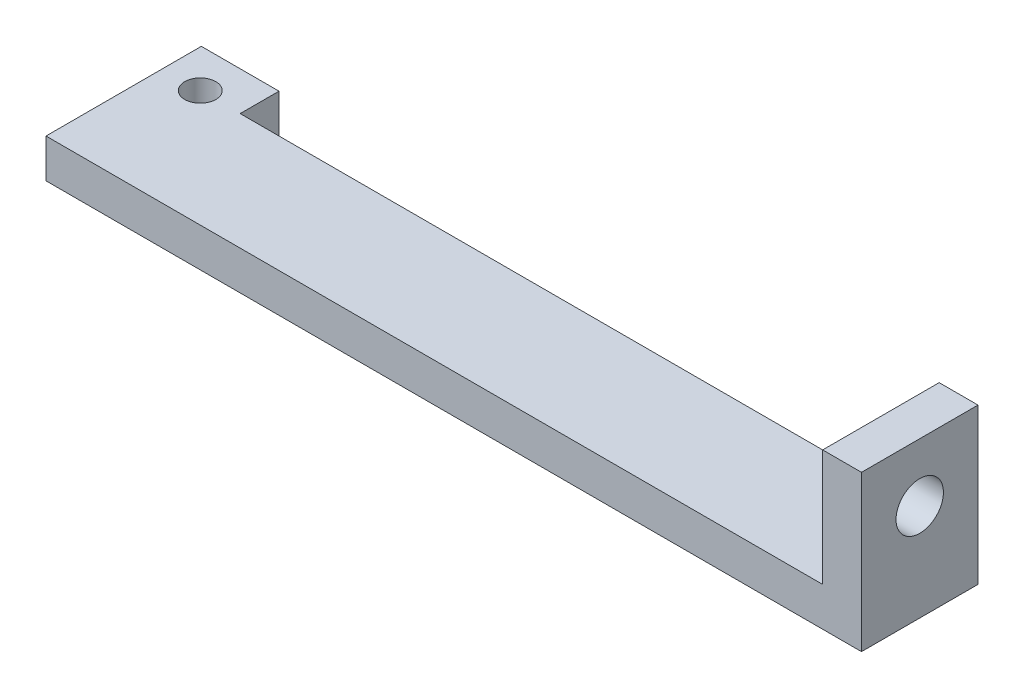
ISO-10303-21;
HEADER;
FILE_DESCRIPTION(('STEP AP214'),'2;1');
FILE_NAME('part.step','',(''),(''),'','','');
FILE_SCHEMA(('AUTOMOTIVE_DESIGN { 1 0 10303 214 1 1 1 1 }'));
ENDSEC;
DATA;
#1=APPLICATION_CONTEXT('core data for automotive mechanical design processes');
#2=APPLICATION_PROTOCOL_DEFINITION('international standard','automotive_design',2000,#1);
#3=PRODUCT_CONTEXT('',#1,'mechanical');
#4=PRODUCT('Part','Part','',(#3));
#5=PRODUCT_RELATED_PRODUCT_CATEGORY('part','',(#4));
#6=PRODUCT_DEFINITION_FORMATION('','',#4);
#7=PRODUCT_DEFINITION_CONTEXT('part definition',#1,'design');
#8=PRODUCT_DEFINITION('design','',#6,#7);
#9=PRODUCT_DEFINITION_SHAPE('','',#8);
#10=(LENGTH_UNIT() NAMED_UNIT(*) SI_UNIT(.MILLI.,.METRE.));
#11=(NAMED_UNIT(*) PLANE_ANGLE_UNIT() SI_UNIT($,.RADIAN.));
#12=(NAMED_UNIT(*) SI_UNIT($,.STERADIAN.) SOLID_ANGLE_UNIT());
#13=UNCERTAINTY_MEASURE_WITH_UNIT(LENGTH_MEASURE(1.E-05),#10,'distance_accuracy_value','');
#14=(GEOMETRIC_REPRESENTATION_CONTEXT(3) GLOBAL_UNCERTAINTY_ASSIGNED_CONTEXT((#13)) GLOBAL_UNIT_ASSIGNED_CONTEXT((#10,
#11,#12)) REPRESENTATION_CONTEXT('',''));
#15=CARTESIAN_POINT('',(0.,0.,0.));
#16=DIRECTION('',(0.,0.,1.));
#17=DIRECTION('',(1.,0.,0.));
#18=AXIS2_PLACEMENT_3D('',#15,#16,#17);
#19=CARTESIAN_POINT('',(0.,2.54,0.));
#20=DIRECTION('',(0.,-1.,0.));
#21=DIRECTION('',(0.,0.,-1.));
#22=AXIS2_PLACEMENT_3D('',#19,#20,#21);
#23=PLANE('',#22);
#24=CARTESIAN_POINT('',(-2.60853382470327,2.54,-7.62));
#25=DIRECTION('',(0.,1.,0.));
#26=DIRECTION('',(0.,0.,1.));
#27=AXIS2_PLACEMENT_3D('',#24,#25,#26);
#28=CIRCLE('',#27,1.016);
#29=CARTESIAN_POINT('',(-2.60853382470327,2.54,-6.604));
#30=VERTEX_POINT('',#29);
#31=EDGE_CURVE('E138',#30,#30,#28,.T.);
#32=ORIENTED_EDGE('',*,*,#31,.F.);
#33=EDGE_LOOP('',(#32));
#34=FACE_BOUND('',#33,.T.);
#35=DIRECTION('',(0.,0.,1.));
#36=VECTOR('',#35,1.);
#37=CARTESIAN_POINT('',(45.72,2.54,0.));
#38=LINE('',#37,#36);
#39=CARTESIAN_POINT('',(45.72,2.54,-7.62));
#40=VERTEX_POINT('',#39);
#41=CARTESIAN_POINT('',(45.72,2.54,0.));
#42=VERTEX_POINT('',#41);
#43=EDGE_CURVE('E54',#40,#42,#38,.T.);
#44=ORIENTED_EDGE('',*,*,#43,.F.);
#45=DIRECTION('',(-1.,0.,0.));
#46=VECTOR('',#45,1.);
#47=CARTESIAN_POINT('',(0.,2.54,-7.62));
#48=LINE('',#47,#46);
#49=CARTESIAN_POINT('',(0.,2.54,-7.62));
#50=VERTEX_POINT('',#49);
#51=EDGE_CURVE('E59',#40,#50,#48,.T.);
#52=ORIENTED_EDGE('',*,*,#51,.T.);
#53=DIRECTION('',(0.,0.,-1.));
#54=VECTOR('',#53,1.);
#55=CARTESIAN_POINT('',(0.,2.54,0.));
#56=LINE('',#55,#54);
#57=CARTESIAN_POINT('',(0.,2.54,-10.16));
#58=VERTEX_POINT('',#57);
#59=EDGE_CURVE('E103',#50,#58,#56,.T.);
#60=ORIENTED_EDGE('',*,*,#59,.T.);
#61=DIRECTION('',(-1.,0.,0.));
#62=VECTOR('',#61,1.);
#63=CARTESIAN_POINT('',(0.,2.54,-10.16));
#64=LINE('',#63,#62);
#65=CARTESIAN_POINT('',(-5.08,2.54,-10.16));
#66=VERTEX_POINT('',#65);
#67=EDGE_CURVE('E150',#58,#66,#64,.T.);
#68=ORIENTED_EDGE('',*,*,#67,.T.);
#69=DIRECTION('',(0.,0.,1.));
#70=VECTOR('',#69,1.);
#71=CARTESIAN_POINT('',(-5.08,2.54,0.));
#72=LINE('',#71,#70);
#73=CARTESIAN_POINT('',(-5.08,2.54,0.));
#74=VERTEX_POINT('',#73);
#75=EDGE_CURVE('E153',#66,#74,#72,.T.);
#76=ORIENTED_EDGE('',*,*,#75,.T.);
#77=DIRECTION('',(1.,0.,0.));
#78=VECTOR('',#77,1.);
#79=CARTESIAN_POINT('',(0.,2.54,0.));
#80=LINE('',#79,#78);
#81=EDGE_CURVE('E84',#74,#42,#80,.T.);
#82=ORIENTED_EDGE('',*,*,#81,.T.);
#83=EDGE_LOOP('',(#44,#52,#60,#68,#76,#82));
#84=FACE_BOUND('',#83,.T.);
#85=ADVANCED_FACE('F39',(#34,#84),#23,.F.);
#86=CARTESIAN_POINT('',(0.,2.54,0.));
#87=DIRECTION('',(0.,0.,-1.));
#88=DIRECTION('',(-1.,0.,0.));
#89=AXIS2_PLACEMENT_3D('',#86,#87,#88);
#90=PLANE('',#89);
#91=DIRECTION('',(1.,0.,0.));
#92=VECTOR('',#91,1.);
#93=CARTESIAN_POINT('',(0.,0.,0.));
#94=LINE('',#93,#92);
#95=CARTESIAN_POINT('',(-5.08,0.,0.));
#96=VERTEX_POINT('',#95);
#97=CARTESIAN_POINT('',(48.26,0.,0.));
#98=VERTEX_POINT('',#97);
#99=EDGE_CURVE('E72',#96,#98,#94,.T.);
#100=ORIENTED_EDGE('',*,*,#99,.T.);
#101=DIRECTION('',(0.,-1.,0.));
#102=VECTOR('',#101,1.);
#103=CARTESIAN_POINT('',(48.26,2.54,0.));
#104=LINE('',#103,#102);
#105=CARTESIAN_POINT('',(48.26,10.16,0.));
#106=VERTEX_POINT('',#105);
#107=EDGE_CURVE('E11',#106,#98,#104,.T.);
#108=ORIENTED_EDGE('',*,*,#107,.F.);
#109=DIRECTION('',(1.,0.,0.));
#110=VECTOR('',#109,1.);
#111=CARTESIAN_POINT('',(45.72,10.16,0.));
#112=LINE('',#111,#110);
#113=CARTESIAN_POINT('',(45.72,10.16,0.));
#114=VERTEX_POINT('',#113);
#115=EDGE_CURVE('E125',#114,#106,#112,.T.);
#116=ORIENTED_EDGE('',*,*,#115,.F.);
#117=DIRECTION('',(0.,1.,0.));
#118=VECTOR('',#117,1.);
#119=CARTESIAN_POINT('',(45.72,10.16,0.));
#120=LINE('',#119,#118);
#121=EDGE_CURVE('E132',#42,#114,#120,.T.);
#122=ORIENTED_EDGE('',*,*,#121,.F.);
#123=ORIENTED_EDGE('',*,*,#81,.F.);
#124=DIRECTION('',(0.,-1.,0.));
#125=VECTOR('',#124,1.);
#126=CARTESIAN_POINT('',(-5.08,2.54,0.));
#127=LINE('',#126,#125);
#128=EDGE_CURVE('E155',#74,#96,#127,.T.);
#129=ORIENTED_EDGE('',*,*,#128,.T.);
#130=EDGE_LOOP('',(#100,#108,#116,#122,#123,#129));
#131=FACE_BOUND('',#130,.T.);
#132=ADVANCED_FACE('F41',(#131),#90,.F.);
#133=CARTESIAN_POINT('',(48.26,2.54,0.));
#134=DIRECTION('',(-1.,0.,0.));
#135=DIRECTION('',(0.,0.,1.));
#136=AXIS2_PLACEMENT_3D('',#133,#134,#135);
#137=PLANE('',#136);
#138=CARTESIAN_POINT('',(48.26,6.35,-3.81));
#139=DIRECTION('',(-1.,0.,0.));
#140=DIRECTION('',(0.,0.,1.));
#141=AXIS2_PLACEMENT_3D('',#138,#139,#140);
#142=CIRCLE('',#141,1.55);
#143=CARTESIAN_POINT('',(48.26,6.35,-2.26));
#144=VERTEX_POINT('',#143);
#145=EDGE_CURVE('E184',#144,#144,#142,.T.);
#146=ORIENTED_EDGE('',*,*,#145,.T.);
#147=EDGE_LOOP('',(#146));
#148=FACE_BOUND('',#147,.T.);
#149=DIRECTION('',(0.,0.,-1.));
#150=VECTOR('',#149,1.);
#151=CARTESIAN_POINT('',(48.26,0.,0.));
#152=LINE('',#151,#150);
#153=CARTESIAN_POINT('',(48.26,0.,-7.62));
#154=VERTEX_POINT('',#153);
#155=EDGE_CURVE('E171',#98,#154,#152,.T.);
#156=ORIENTED_EDGE('',*,*,#155,.T.);
#157=DIRECTION('',(0.,-1.,0.));
#158=VECTOR('',#157,1.);
#159=CARTESIAN_POINT('',(48.26,2.54,-7.62));
#160=LINE('',#159,#158);
#161=CARTESIAN_POINT('',(48.26,10.16,-7.62));
#162=VERTEX_POINT('',#161);
#163=EDGE_CURVE('E47',#162,#154,#160,.T.);
#164=ORIENTED_EDGE('',*,*,#163,.F.);
#165=DIRECTION('',(0.,0.,-1.));
#166=VECTOR('',#165,1.);
#167=CARTESIAN_POINT('',(48.26,10.16,-7.62));
#168=LINE('',#167,#166);
#169=EDGE_CURVE('E135',#106,#162,#168,.T.);
#170=ORIENTED_EDGE('',*,*,#169,.F.);
#171=ORIENTED_EDGE('',*,*,#107,.T.);
#172=EDGE_LOOP('',(#156,#164,#170,#171));
#173=FACE_BOUND('',#172,.T.);
#174=ADVANCED_FACE('F214',(#148,#173),#137,.F.);
#175=CARTESIAN_POINT('',(0.,2.54,-7.62));
#176=DIRECTION('',(0.,0.,1.));
#177=DIRECTION('',(1.,0.,0.));
#178=AXIS2_PLACEMENT_3D('',#175,#176,#177);
#179=PLANE('',#178);
#180=DIRECTION('',(-1.,0.,0.));
#181=VECTOR('',#180,1.);
#182=CARTESIAN_POINT('',(0.,0.,-7.62));
#183=LINE('',#182,#181);
#184=CARTESIAN_POINT('',(0.,0.,-7.62));
#185=VERTEX_POINT('',#184);
#186=EDGE_CURVE('E78',#154,#185,#183,.T.);
#187=ORIENTED_EDGE('',*,*,#186,.T.);
#188=DIRECTION('',(0.,-1.,0.));
#189=VECTOR('',#188,1.);
#190=CARTESIAN_POINT('',(0.,2.54,-7.62));
#191=LINE('',#190,#189);
#192=EDGE_CURVE('E169',#50,#185,#191,.T.);
#193=ORIENTED_EDGE('',*,*,#192,.F.);
#194=ORIENTED_EDGE('',*,*,#51,.F.);
#195=DIRECTION('',(0.,-1.,0.));
#196=VECTOR('',#195,1.);
#197=CARTESIAN_POINT('',(45.72,2.54,-7.62));
#198=LINE('',#197,#196);
#199=CARTESIAN_POINT('',(45.72,10.16,-7.62));
#200=VERTEX_POINT('',#199);
#201=EDGE_CURVE('E131',#200,#40,#198,.T.);
#202=ORIENTED_EDGE('',*,*,#201,.F.);
#203=DIRECTION('',(1.,0.,0.));
#204=VECTOR('',#203,1.);
#205=CARTESIAN_POINT('',(45.72,10.16,-7.62));
#206=LINE('',#205,#204);
#207=EDGE_CURVE('E127',#200,#162,#206,.T.);
#208=ORIENTED_EDGE('',*,*,#207,.T.);
#209=ORIENTED_EDGE('',*,*,#163,.T.);
#210=EDGE_LOOP('',(#187,#193,#194,#202,#208,#209));
#211=FACE_BOUND('',#210,.T.);
#212=ADVANCED_FACE('F174',(#211),#179,.F.);
#213=CARTESIAN_POINT('',(0.,0.,0.));
#214=DIRECTION('',(0.,-1.,0.));
#215=DIRECTION('',(0.,0.,-1.));
#216=AXIS2_PLACEMENT_3D('',#213,#214,#215);
#217=PLANE('',#216);
#218=CARTESIAN_POINT('',(-2.60853382470327,0.,-7.62));
#219=DIRECTION('',(0.,1.,0.));
#220=DIRECTION('',(0.,0.,1.));
#221=AXIS2_PLACEMENT_3D('',#218,#219,#220);
#222=CIRCLE('',#221,1.016);
#223=CARTESIAN_POINT('',(-2.60853382470327,0.,-6.604));
#224=VERTEX_POINT('',#223);
#225=EDGE_CURVE('E141',#224,#224,#222,.T.);
#226=ORIENTED_EDGE('',*,*,#225,.T.);
#227=EDGE_LOOP('',(#226));
#228=FACE_BOUND('',#227,.T.);
#229=ORIENTED_EDGE('',*,*,#99,.F.);
#230=DIRECTION('',(0.,0.,1.));
#231=VECTOR('',#230,1.);
#232=CARTESIAN_POINT('',(-5.08,0.,0.));
#233=LINE('',#232,#231);
#234=CARTESIAN_POINT('',(-5.08,0.,-10.16));
#235=VERTEX_POINT('',#234);
#236=EDGE_CURVE('E151',#235,#96,#233,.T.);
#237=ORIENTED_EDGE('',*,*,#236,.F.);
#238=DIRECTION('',(-1.,0.,0.));
#239=VECTOR('',#238,1.);
#240=CARTESIAN_POINT('',(0.,0.,-10.16));
#241=LINE('',#240,#239);
#242=CARTESIAN_POINT('',(0.,0.,-10.16));
#243=VERTEX_POINT('',#242);
#244=EDGE_CURVE('E157',#243,#235,#241,.T.);
#245=ORIENTED_EDGE('',*,*,#244,.F.);
#246=DIRECTION('',(0.,0.,-1.));
#247=VECTOR('',#246,1.);
#248=CARTESIAN_POINT('',(0.,0.,0.));
#249=LINE('',#248,#247);
#250=EDGE_CURVE('E147',#185,#243,#249,.T.);
#251=ORIENTED_EDGE('',*,*,#250,.F.);
#252=ORIENTED_EDGE('',*,*,#186,.F.);
#253=ORIENTED_EDGE('',*,*,#155,.F.);
#254=EDGE_LOOP('',(#229,#237,#245,#251,#252,#253));
#255=FACE_BOUND('',#254,.T.);
#256=ADVANCED_FACE('F177',(#228,#255),#217,.T.);
#257=CARTESIAN_POINT('',(0.,2.54,0.));
#258=DIRECTION('',(-1.,0.,0.));
#259=DIRECTION('',(0.,0.,1.));
#260=AXIS2_PLACEMENT_3D('',#257,#258,#259);
#261=PLANE('',#260);
#262=ORIENTED_EDGE('',*,*,#59,.F.);
#263=ORIENTED_EDGE('',*,*,#192,.T.);
#264=ORIENTED_EDGE('',*,*,#250,.T.);
#265=DIRECTION('',(0.,-1.,0.));
#266=VECTOR('',#265,1.);
#267=CARTESIAN_POINT('',(0.,2.54,-10.16));
#268=LINE('',#267,#266);
#269=EDGE_CURVE('E164',#58,#243,#268,.T.);
#270=ORIENTED_EDGE('',*,*,#269,.F.);
#271=EDGE_LOOP('',(#262,#263,#264,#270));
#272=FACE_BOUND('',#271,.T.);
#273=ADVANCED_FACE('F181',(#272),#261,.F.);
#274=CARTESIAN_POINT('',(0.,2.54,-10.16));
#275=DIRECTION('',(0.,0.,1.));
#276=DIRECTION('',(1.,0.,0.));
#277=AXIS2_PLACEMENT_3D('',#274,#275,#276);
#278=PLANE('',#277);
#279=ORIENTED_EDGE('',*,*,#244,.T.);
#280=DIRECTION('',(0.,-1.,0.));
#281=VECTOR('',#280,1.);
#282=CARTESIAN_POINT('',(-5.08,2.54,-10.16));
#283=LINE('',#282,#281);
#284=EDGE_CURVE('E161',#66,#235,#283,.T.);
#285=ORIENTED_EDGE('',*,*,#284,.F.);
#286=ORIENTED_EDGE('',*,*,#67,.F.);
#287=ORIENTED_EDGE('',*,*,#269,.T.);
#288=EDGE_LOOP('',(#279,#285,#286,#287));
#289=FACE_BOUND('',#288,.T.);
#290=ADVANCED_FACE('F279',(#289),#278,.F.);
#291=CARTESIAN_POINT('',(-5.08,2.54,0.));
#292=DIRECTION('',(1.,0.,0.));
#293=DIRECTION('',(0.,0.,-1.));
#294=AXIS2_PLACEMENT_3D('',#291,#292,#293);
#295=PLANE('',#294);
#296=ORIENTED_EDGE('',*,*,#236,.T.);
#297=ORIENTED_EDGE('',*,*,#128,.F.);
#298=ORIENTED_EDGE('',*,*,#75,.F.);
#299=ORIENTED_EDGE('',*,*,#284,.T.);
#300=EDGE_LOOP('',(#296,#297,#298,#299));
#301=FACE_BOUND('',#300,.T.);
#302=ADVANCED_FACE('F270',(#301),#295,.F.);
#303=CARTESIAN_POINT('',(-2.60853382470327,0.,-7.62));
#304=DIRECTION('',(0.,1.,0.));
#305=DIRECTION('',(0.,0.,1.));
#306=AXIS2_PLACEMENT_3D('',#303,#304,#305);
#307=CYLINDRICAL_SURFACE('',#306,1.016);
#308=ORIENTED_EDGE('',*,*,#225,.F.);
#309=EDGE_LOOP('',(#308));
#310=FACE_BOUND('',#309,.T.);
#311=ORIENTED_EDGE('',*,*,#31,.T.);
#312=EDGE_LOOP('',(#311));
#313=FACE_BOUND('',#312,.T.);
#314=ADVANCED_FACE('F205',(#310,#313),#307,.F.);
#315=CARTESIAN_POINT('',(45.72,10.16,-7.62));
#316=DIRECTION('',(0.,-1.,0.));
#317=DIRECTION('',(0.,0.,-1.));
#318=AXIS2_PLACEMENT_3D('',#315,#316,#317);
#319=PLANE('',#318);
#320=ORIENTED_EDGE('',*,*,#169,.T.);
#321=ORIENTED_EDGE('',*,*,#207,.F.);
#322=DIRECTION('',(0.,0.,-1.));
#323=VECTOR('',#322,1.);
#324=CARTESIAN_POINT('',(45.72,10.16,-7.62));
#325=LINE('',#324,#323);
#326=EDGE_CURVE('E120',#114,#200,#325,.T.);
#327=ORIENTED_EDGE('',*,*,#326,.F.);
#328=ORIENTED_EDGE('',*,*,#115,.T.);
#329=EDGE_LOOP('',(#320,#321,#327,#328));
#330=FACE_BOUND('',#329,.T.);
#331=ADVANCED_FACE('F123',(#330),#319,.F.);
#332=CARTESIAN_POINT('',(45.72,0.,0.));
#333=DIRECTION('',(1.,0.,0.));
#334=DIRECTION('',(0.,0.,-1.));
#335=AXIS2_PLACEMENT_3D('',#332,#333,#334);
#336=PLANE('',#335);
#337=CARTESIAN_POINT('',(45.72,6.35,-3.81));
#338=DIRECTION('',(-1.,0.,0.));
#339=DIRECTION('',(0.,0.,1.));
#340=AXIS2_PLACEMENT_3D('',#337,#338,#339);
#341=CIRCLE('',#340,1.55);
#342=CARTESIAN_POINT('',(45.72,6.35,-2.26));
#343=VERTEX_POINT('',#342);
#344=EDGE_CURVE('E186',#343,#343,#341,.T.);
#345=ORIENTED_EDGE('',*,*,#344,.F.);
#346=EDGE_LOOP('',(#345));
#347=FACE_BOUND('',#346,.T.);
#348=ORIENTED_EDGE('',*,*,#121,.T.);
#349=ORIENTED_EDGE('',*,*,#326,.T.);
#350=ORIENTED_EDGE('',*,*,#201,.T.);
#351=ORIENTED_EDGE('',*,*,#43,.T.);
#352=EDGE_LOOP('',(#348,#349,#350,#351));
#353=FACE_BOUND('',#352,.T.);
#354=ADVANCED_FACE('F134',(#347,#353),#336,.F.);
#355=CARTESIAN_POINT('',(48.26,6.35,-3.81));
#356=DIRECTION('',(-1.,0.,0.));
#357=DIRECTION('',(0.,0.,1.));
#358=AXIS2_PLACEMENT_3D('',#355,#356,#357);
#359=CYLINDRICAL_SURFACE('',#358,1.55);
#360=ORIENTED_EDGE('',*,*,#145,.F.);
#361=EDGE_LOOP('',(#360));
#362=FACE_BOUND('',#361,.T.);
#363=ORIENTED_EDGE('',*,*,#344,.T.);
#364=EDGE_LOOP('',(#363));
#365=FACE_BOUND('',#364,.T.);
#366=ADVANCED_FACE('F194',(#362,#365),#359,.F.);
#367=CLOSED_SHELL('',(#85,#132,#174,#212,#256,#273,#290,#302,#314,#331,#354,#366));
#368=MANIFOLD_SOLID_BREP('B2',#367);
#369=ADVANCED_BREP_SHAPE_REPRESENTATION('',(#18,#368),#14);
#370=SHAPE_DEFINITION_REPRESENTATION(#9,#369);
ENDSEC;
END-ISO-10303-21;
